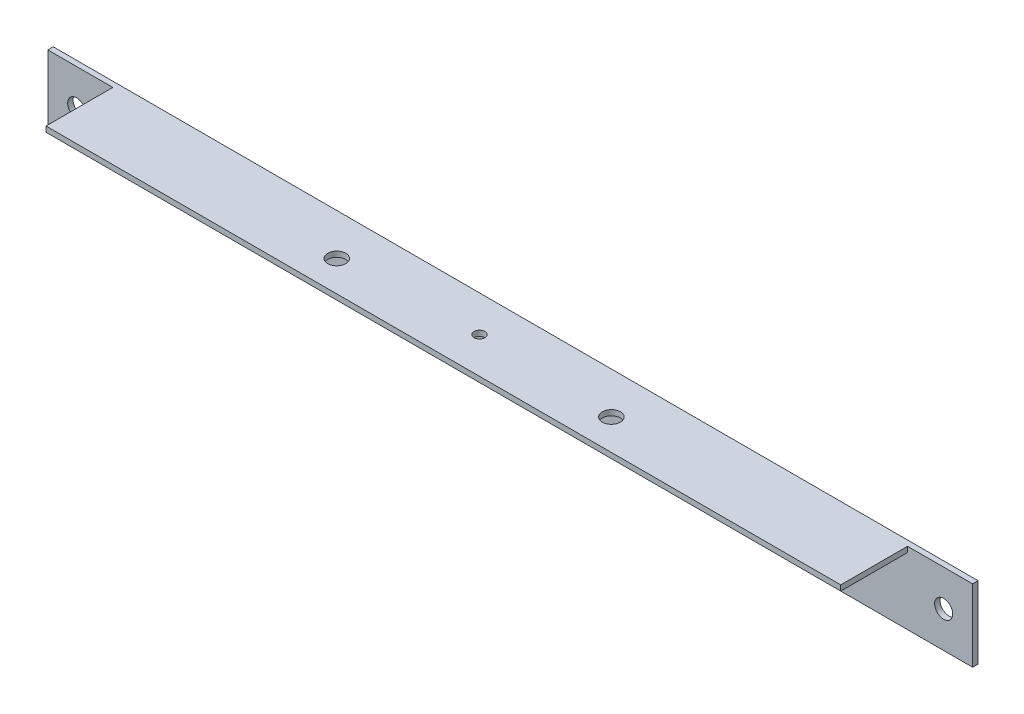
ISO-10303-21;
HEADER;
FILE_DESCRIPTION(('STEP AP214'),'2;1');
FILE_NAME('part.step','',(''),(''),'','','');
FILE_SCHEMA(('AUTOMOTIVE_DESIGN { 1 0 10303 214 1 1 1 1 }'));
ENDSEC;
DATA;
#1=APPLICATION_CONTEXT('core data for automotive mechanical design processes');
#2=APPLICATION_PROTOCOL_DEFINITION('international standard','automotive_design',2000,#1);
#3=PRODUCT_CONTEXT('',#1,'mechanical');
#4=PRODUCT('Part','Part','',(#3));
#5=PRODUCT_RELATED_PRODUCT_CATEGORY('part','',(#4));
#6=PRODUCT_DEFINITION_FORMATION('','',#4);
#7=PRODUCT_DEFINITION_CONTEXT('part definition',#1,'design');
#8=PRODUCT_DEFINITION('design','',#6,#7);
#9=PRODUCT_DEFINITION_SHAPE('','',#8);
#10=(LENGTH_UNIT() NAMED_UNIT(*) SI_UNIT(.MILLI.,.METRE.));
#11=(NAMED_UNIT(*) PLANE_ANGLE_UNIT() SI_UNIT($,.RADIAN.));
#12=(NAMED_UNIT(*) SI_UNIT($,.STERADIAN.) SOLID_ANGLE_UNIT());
#13=UNCERTAINTY_MEASURE_WITH_UNIT(LENGTH_MEASURE(1.E-05),#10,'distance_accuracy_value','');
#14=(GEOMETRIC_REPRESENTATION_CONTEXT(3) GLOBAL_UNCERTAINTY_ASSIGNED_CONTEXT((#13)) GLOBAL_UNIT_ASSIGNED_CONTEXT((#10,
#11,#12)) REPRESENTATION_CONTEXT('',''));
#15=CARTESIAN_POINT('',(0.,0.,0.));
#16=DIRECTION('',(0.,0.,1.));
#17=DIRECTION('',(1.,0.,0.));
#18=AXIS2_PLACEMENT_3D('',#15,#16,#17);
#19=CARTESIAN_POINT('',(128.,0.,1.5));
#20=DIRECTION('',(0.,0.,-1.));
#21=DIRECTION('',(0.,1.,0.));
#22=AXIS2_PLACEMENT_3D('',#19,#20,#21);
#23=PLANE('',#22);
#24=CARTESIAN_POINT('',(20.,-10.,1.5));
#25=DIRECTION('',(0.,0.,-1.));
#26=DIRECTION('',(0.,1.,0.));
#27=AXIS2_PLACEMENT_3D('',#24,#25,#26);
#28=CIRCLE('',#27,1.5);
#29=CARTESIAN_POINT('',(20.,-8.5,1.5));
#30=VERTEX_POINT('',#29);
#31=EDGE_CURVE('E227',#30,#30,#28,.T.);
#32=ORIENTED_EDGE('',*,*,#31,.T.);
#33=EDGE_LOOP('',(#32));
#34=FACE_BOUND('',#33,.T.);
#35=CARTESIAN_POINT('',(-20.,-10.,1.5));
#36=DIRECTION('',(0.,0.,-1.));
#37=DIRECTION('',(0.,1.,0.));
#38=AXIS2_PLACEMENT_3D('',#35,#36,#37);
#39=CIRCLE('',#38,1.5);
#40=CARTESIAN_POINT('',(-20.,-8.5,1.5));
#41=VERTEX_POINT('',#40);
#42=EDGE_CURVE('E230',#41,#41,#39,.T.);
#43=ORIENTED_EDGE('',*,*,#42,.T.);
#44=EDGE_LOOP('',(#43));
#45=FACE_BOUND('',#44,.T.);
#46=CARTESIAN_POINT('',(120.,-9.99999999999995,1.5));
#47=DIRECTION('',(0.,0.,1.));
#48=DIRECTION('',(-1.,0.,0.));
#49=AXIS2_PLACEMENT_3D('',#46,#47,#48);
#50=CIRCLE('',#49,2.5);
#51=CARTESIAN_POINT('',(117.5,-9.99999999999995,1.5));
#52=VERTEX_POINT('',#51);
#53=EDGE_CURVE('E146',#52,#52,#50,.T.);
#54=ORIENTED_EDGE('',*,*,#53,.F.);
#55=EDGE_LOOP('',(#54));
#56=FACE_BOUND('',#55,.T.);
#57=CARTESIAN_POINT('',(-120.,-9.99999999999995,1.5));
#58=DIRECTION('',(0.,0.,1.));
#59=DIRECTION('',(1.,0.,0.));
#60=AXIS2_PLACEMENT_3D('',#57,#58,#59);
#61=CIRCLE('',#60,2.5);
#62=CARTESIAN_POINT('',(-117.5,-9.99999999999995,1.5));
#63=VERTEX_POINT('',#62);
#64=EDGE_CURVE('E143',#63,#63,#61,.T.);
#65=ORIENTED_EDGE('',*,*,#64,.F.);
#66=EDGE_LOOP('',(#65));
#67=FACE_BOUND('',#66,.T.);
#68=DIRECTION('',(0.,-1.,0.));
#69=VECTOR('',#68,1.);
#70=CARTESIAN_POINT('',(-128.,0.,1.5));
#71=LINE('',#70,#69);
#72=CARTESIAN_POINT('',(-128.,0.,1.5));
#73=VERTEX_POINT('',#72);
#74=CARTESIAN_POINT('',(-128.,-20.,1.5));
#75=VERTEX_POINT('',#74);
#76=EDGE_CURVE('E49',#73,#75,#71,.T.);
#77=ORIENTED_EDGE('',*,*,#76,.T.);
#78=DIRECTION('',(-1.,0.,0.));
#79=VECTOR('',#78,1.);
#80=CARTESIAN_POINT('',(128.,-20.,1.5));
#81=LINE('',#80,#79);
#82=CARTESIAN_POINT('',(128.,-20.,1.5));
#83=VERTEX_POINT('',#82);
#84=EDGE_CURVE('E11',#83,#75,#81,.T.);
#85=ORIENTED_EDGE('',*,*,#84,.F.);
#86=DIRECTION('',(0.,-1.,0.));
#87=VECTOR('',#86,1.);
#88=CARTESIAN_POINT('',(128.,0.,1.5));
#89=LINE('',#88,#87);
#90=CARTESIAN_POINT('',(128.,0.,1.5));
#91=VERTEX_POINT('',#90);
#92=EDGE_CURVE('E78',#91,#83,#89,.T.);
#93=ORIENTED_EDGE('',*,*,#92,.F.);
#94=DIRECTION('',(-1.,0.,0.));
#95=VECTOR('',#94,1.);
#96=CARTESIAN_POINT('',(128.,0.,1.5));
#97=LINE('',#96,#95);
#98=CARTESIAN_POINT('',(110.,0.,1.5));
#99=VERTEX_POINT('',#98);
#100=EDGE_CURVE('E192',#91,#99,#97,.T.);
#101=ORIENTED_EDGE('',*,*,#100,.T.);
#102=DIRECTION('',(0.,-1.,0.));
#103=VECTOR('',#102,1.);
#104=CARTESIAN_POINT('',(110.,8.5,1.5));
#105=LINE('',#104,#103);
#106=CARTESIAN_POINT('',(110.,-1.5,1.5));
#107=VERTEX_POINT('',#106);
#108=EDGE_CURVE('E119',#99,#107,#105,.T.);
#109=ORIENTED_EDGE('',*,*,#108,.T.);
#110=DIRECTION('',(-1.,0.,0.));
#111=VECTOR('',#110,1.);
#112=CARTESIAN_POINT('',(128.,-1.5,1.5));
#113=LINE('',#112,#111);
#114=CARTESIAN_POINT('',(-110.,-1.5,1.5));
#115=VERTEX_POINT('',#114);
#116=EDGE_CURVE('E126',#107,#115,#113,.T.);
#117=ORIENTED_EDGE('',*,*,#116,.T.);
#118=DIRECTION('',(0.,-1.,0.));
#119=VECTOR('',#118,1.);
#120=CARTESIAN_POINT('',(-110.,8.5,1.5));
#121=LINE('',#120,#119);
#122=CARTESIAN_POINT('',(-110.,0.,1.5));
#123=VERTEX_POINT('',#122);
#124=EDGE_CURVE('E186',#123,#115,#121,.T.);
#125=ORIENTED_EDGE('',*,*,#124,.F.);
#126=DIRECTION('',(-1.,0.,0.));
#127=VECTOR('',#126,1.);
#128=CARTESIAN_POINT('',(128.,0.,1.5));
#129=LINE('',#128,#127);
#130=EDGE_CURVE('E184',#123,#73,#129,.T.);
#131=ORIENTED_EDGE('',*,*,#130,.T.);
#132=EDGE_LOOP('',(#77,#85,#93,#101,#109,#117,#125,#131));
#133=FACE_BOUND('',#132,.T.);
#134=ADVANCED_FACE('F33',(#34,#45,#56,#67,#133),#23,.F.);
#135=CARTESIAN_POINT('',(128.,-20.,0.));
#136=DIRECTION('',(0.,-1.,0.));
#137=DIRECTION('',(0.,0.,-1.));
#138=AXIS2_PLACEMENT_3D('',#135,#136,#137);
#139=PLANE('',#138);
#140=DIRECTION('',(0.,0.,1.));
#141=VECTOR('',#140,1.);
#142=CARTESIAN_POINT('',(-128.,-20.,0.));
#143=LINE('',#142,#141);
#144=CARTESIAN_POINT('',(-128.,-20.,0.));
#145=VERTEX_POINT('',#144);
#146=EDGE_CURVE('E170',#145,#75,#143,.T.);
#147=ORIENTED_EDGE('',*,*,#146,.F.);
#148=DIRECTION('',(-1.,0.,0.));
#149=VECTOR('',#148,1.);
#150=CARTESIAN_POINT('',(128.,-20.,0.));
#151=LINE('',#150,#149);
#152=CARTESIAN_POINT('',(128.,-20.,0.));
#153=VERTEX_POINT('',#152);
#154=EDGE_CURVE('E41',#153,#145,#151,.T.);
#155=ORIENTED_EDGE('',*,*,#154,.F.);
#156=DIRECTION('',(0.,0.,1.));
#157=VECTOR('',#156,1.);
#158=CARTESIAN_POINT('',(128.,-20.,0.));
#159=LINE('',#158,#157);
#160=EDGE_CURVE('E162',#153,#83,#159,.T.);
#161=ORIENTED_EDGE('',*,*,#160,.T.);
#162=ORIENTED_EDGE('',*,*,#84,.T.);
#163=EDGE_LOOP('',(#147,#155,#161,#162));
#164=FACE_BOUND('',#163,.T.);
#165=ADVANCED_FACE('F180',(#164),#139,.T.);
#166=CARTESIAN_POINT('',(128.,0.,0.));
#167=DIRECTION('',(0.,0.,-1.));
#168=DIRECTION('',(0.,1.,0.));
#169=AXIS2_PLACEMENT_3D('',#166,#167,#168);
#170=PLANE('',#169);
#171=CARTESIAN_POINT('',(20.,-10.,0.));
#172=DIRECTION('',(0.,0.,-1.));
#173=DIRECTION('',(0.,1.,0.));
#174=AXIS2_PLACEMENT_3D('',#171,#172,#173);
#175=CIRCLE('',#174,1.5);
#176=CARTESIAN_POINT('',(20.,-8.5,0.));
#177=VERTEX_POINT('',#176);
#178=EDGE_CURVE('E233',#177,#177,#175,.T.);
#179=ORIENTED_EDGE('',*,*,#178,.F.);
#180=EDGE_LOOP('',(#179));
#181=FACE_BOUND('',#180,.T.);
#182=CARTESIAN_POINT('',(-20.,-10.,0.));
#183=DIRECTION('',(0.,0.,-1.));
#184=DIRECTION('',(0.,-1.,0.));
#185=AXIS2_PLACEMENT_3D('',#182,#183,#184);
#186=CIRCLE('',#185,1.5);
#187=CARTESIAN_POINT('',(-20.,-11.5,0.));
#188=VERTEX_POINT('',#187);
#189=EDGE_CURVE('E234',#188,#188,#186,.T.);
#190=ORIENTED_EDGE('',*,*,#189,.F.);
#191=EDGE_LOOP('',(#190));
#192=FACE_BOUND('',#191,.T.);
#193=CARTESIAN_POINT('',(120.,-9.99999999999995,0.));
#194=DIRECTION('',(0.,0.,-1.));
#195=DIRECTION('',(0.,1.,0.));
#196=AXIS2_PLACEMENT_3D('',#193,#194,#195);
#197=CIRCLE('',#196,2.5);
#198=CARTESIAN_POINT('',(120.,-7.49999999999996,0.));
#199=VERTEX_POINT('',#198);
#200=EDGE_CURVE('E144',#199,#199,#197,.T.);
#201=ORIENTED_EDGE('',*,*,#200,.F.);
#202=EDGE_LOOP('',(#201));
#203=FACE_BOUND('',#202,.T.);
#204=CARTESIAN_POINT('',(-120.,-9.99999999999995,0.));
#205=DIRECTION('',(0.,0.,-1.));
#206=DIRECTION('',(0.,1.,0.));
#207=AXIS2_PLACEMENT_3D('',#204,#205,#206);
#208=CIRCLE('',#207,2.5);
#209=CARTESIAN_POINT('',(-120.,-7.49999999999996,0.));
#210=VERTEX_POINT('',#209);
#211=EDGE_CURVE('E141',#210,#210,#208,.T.);
#212=ORIENTED_EDGE('',*,*,#211,.F.);
#213=EDGE_LOOP('',(#212));
#214=FACE_BOUND('',#213,.T.);
#215=DIRECTION('',(0.,-1.,0.));
#216=VECTOR('',#215,1.);
#217=CARTESIAN_POINT('',(-128.,0.,0.));
#218=LINE('',#217,#216);
#219=CARTESIAN_POINT('',(-128.,0.,0.));
#220=VERTEX_POINT('',#219);
#221=EDGE_CURVE('E172',#220,#145,#218,.T.);
#222=ORIENTED_EDGE('',*,*,#221,.F.);
#223=DIRECTION('',(-1.,0.,0.));
#224=VECTOR('',#223,1.);
#225=CARTESIAN_POINT('',(128.,0.,0.));
#226=LINE('',#225,#224);
#227=CARTESIAN_POINT('',(128.,0.,0.));
#228=VERTEX_POINT('',#227);
#229=EDGE_CURVE('E134',#228,#220,#226,.T.);
#230=ORIENTED_EDGE('',*,*,#229,.F.);
#231=DIRECTION('',(0.,-1.,0.));
#232=VECTOR('',#231,1.);
#233=CARTESIAN_POINT('',(128.,0.,0.));
#234=LINE('',#233,#232);
#235=EDGE_CURVE('E165',#228,#153,#234,.T.);
#236=ORIENTED_EDGE('',*,*,#235,.T.);
#237=ORIENTED_EDGE('',*,*,#154,.T.);
#238=EDGE_LOOP('',(#222,#230,#236,#237));
#239=FACE_BOUND('',#238,.T.);
#240=ADVANCED_FACE('F177',(#181,#192,#203,#214,#239),#170,.T.);
#241=CARTESIAN_POINT('',(128.,0.,20.));
#242=DIRECTION('',(0.,1.,0.));
#243=DIRECTION('',(0.,0.,1.));
#244=AXIS2_PLACEMENT_3D('',#241,#242,#243);
#245=PLANE('',#244);
#246=CARTESIAN_POINT('',(0.,0.,10.));
#247=DIRECTION('',(0.,1.,0.));
#248=DIRECTION('',(0.,0.,1.));
#249=AXIS2_PLACEMENT_3D('',#246,#247,#248);
#250=CIRCLE('',#249,1.5);
#251=CARTESIAN_POINT('',(0.,0.,11.5));
#252=VERTEX_POINT('',#251);
#253=EDGE_CURVE('E224',#252,#252,#250,.T.);
#254=ORIENTED_EDGE('',*,*,#253,.F.);
#255=EDGE_LOOP('',(#254));
#256=FACE_BOUND('',#255,.T.);
#257=ORIENTED_EDGE('',*,*,#100,.F.);
#258=DIRECTION('',(0.,0.,-1.));
#259=VECTOR('',#258,1.);
#260=CARTESIAN_POINT('',(128.,0.,20.));
#261=LINE('',#260,#259);
#262=EDGE_CURVE('E58',#91,#228,#261,.T.);
#263=ORIENTED_EDGE('',*,*,#262,.T.);
#264=ORIENTED_EDGE('',*,*,#229,.T.);
#265=DIRECTION('',(0.,0.,-1.));
#266=VECTOR('',#265,1.);
#267=CARTESIAN_POINT('',(-128.,0.,20.));
#268=LINE('',#267,#266);
#269=EDGE_CURVE('E73',#73,#220,#268,.T.);
#270=ORIENTED_EDGE('',*,*,#269,.F.);
#271=ORIENTED_EDGE('',*,*,#130,.F.);
#272=DIRECTION('',(0.,0.,-1.));
#273=VECTOR('',#272,1.);
#274=CARTESIAN_POINT('',(-110.,0.,19.9999999999998));
#275=LINE('',#274,#273);
#276=CARTESIAN_POINT('',(-110.,0.,20.));
#277=VERTEX_POINT('',#276);
#278=EDGE_CURVE('E188',#277,#123,#275,.T.);
#279=ORIENTED_EDGE('',*,*,#278,.F.);
#280=DIRECTION('',(-1.,0.,0.));
#281=VECTOR('',#280,1.);
#282=CARTESIAN_POINT('',(128.,0.,20.));
#283=LINE('',#282,#281);
#284=CARTESIAN_POINT('',(110.,0.,20.));
#285=VERTEX_POINT('',#284);
#286=EDGE_CURVE('E132',#285,#277,#283,.T.);
#287=ORIENTED_EDGE('',*,*,#286,.F.);
#288=DIRECTION('',(0.,0.,1.));
#289=VECTOR('',#288,1.);
#290=CARTESIAN_POINT('',(110.,0.,20.));
#291=LINE('',#290,#289);
#292=EDGE_CURVE('E115',#99,#285,#291,.T.);
#293=ORIENTED_EDGE('',*,*,#292,.F.);
#294=EDGE_LOOP('',(#257,#263,#264,#270,#271,#279,#287,#293));
#295=FACE_BOUND('',#294,.T.);
#296=CARTESIAN_POINT('',(38.,0.,11.5));
#297=DIRECTION('',(0.,1.,0.));
#298=DIRECTION('',(0.,0.,1.));
#299=AXIS2_PLACEMENT_3D('',#296,#297,#298);
#300=CIRCLE('',#299,2.5);
#301=CARTESIAN_POINT('',(38.,0.,14.));
#302=VERTEX_POINT('',#301);
#303=EDGE_CURVE('E199',#302,#302,#300,.T.);
#304=ORIENTED_EDGE('',*,*,#303,.F.);
#305=EDGE_LOOP('',(#304));
#306=FACE_BOUND('',#305,.T.);
#307=CARTESIAN_POINT('',(-38.,0.,11.5));
#308=DIRECTION('',(0.,1.,0.));
#309=DIRECTION('',(0.,0.,1.));
#310=AXIS2_PLACEMENT_3D('',#307,#308,#309);
#311=CIRCLE('',#310,2.5);
#312=CARTESIAN_POINT('',(-38.,0.,14.));
#313=VERTEX_POINT('',#312);
#314=EDGE_CURVE('E152',#313,#313,#311,.T.);
#315=ORIENTED_EDGE('',*,*,#314,.F.);
#316=EDGE_LOOP('',(#315));
#317=FACE_BOUND('',#316,.T.);
#318=ADVANCED_FACE('F190',(#256,#295,#306,#317),#245,.T.);
#319=CARTESIAN_POINT('',(128.,-1.5,20.));
#320=DIRECTION('',(0.,0.,1.));
#321=DIRECTION('',(1.,0.,0.));
#322=AXIS2_PLACEMENT_3D('',#319,#320,#321);
#323=PLANE('',#322);
#324=DIRECTION('',(0.,-1.,0.));
#325=VECTOR('',#324,1.);
#326=CARTESIAN_POINT('',(110.,8.5,20.));
#327=LINE('',#326,#325);
#328=CARTESIAN_POINT('',(110.,-1.5,20.));
#329=VERTEX_POINT('',#328);
#330=EDGE_CURVE('E108',#285,#329,#327,.T.);
#331=ORIENTED_EDGE('',*,*,#330,.F.);
#332=ORIENTED_EDGE('',*,*,#286,.T.);
#333=DIRECTION('',(0.,-1.,0.));
#334=VECTOR('',#333,1.);
#335=CARTESIAN_POINT('',(-110.,8.5,20.));
#336=LINE('',#335,#334);
#337=CARTESIAN_POINT('',(-110.,-1.5,20.));
#338=VERTEX_POINT('',#337);
#339=EDGE_CURVE('E131',#277,#338,#336,.T.);
#340=ORIENTED_EDGE('',*,*,#339,.T.);
#341=DIRECTION('',(-1.,0.,0.));
#342=VECTOR('',#341,1.);
#343=CARTESIAN_POINT('',(128.,-1.5,20.));
#344=LINE('',#343,#342);
#345=EDGE_CURVE('E124',#329,#338,#344,.T.);
#346=ORIENTED_EDGE('',*,*,#345,.F.);
#347=EDGE_LOOP('',(#331,#332,#340,#346));
#348=FACE_BOUND('',#347,.T.);
#349=ADVANCED_FACE('F129',(#348),#323,.T.);
#350=CARTESIAN_POINT('',(128.,-1.5,20.));
#351=DIRECTION('',(0.,1.,0.));
#352=DIRECTION('',(0.,0.,1.));
#353=AXIS2_PLACEMENT_3D('',#350,#351,#352);
#354=PLANE('',#353);
#355=CARTESIAN_POINT('',(0.,-1.5,10.));
#356=DIRECTION('',(0.,1.,0.));
#357=DIRECTION('',(0.,0.,1.));
#358=AXIS2_PLACEMENT_3D('',#355,#356,#357);
#359=CIRCLE('',#358,1.5);
#360=CARTESIAN_POINT('',(0.,-1.5,11.5));
#361=VERTEX_POINT('',#360);
#362=EDGE_CURVE('E36',#361,#361,#359,.T.);
#363=ORIENTED_EDGE('',*,*,#362,.T.);
#364=EDGE_LOOP('',(#363));
#365=FACE_BOUND('',#364,.T.);
#366=CARTESIAN_POINT('',(38.,-1.5,11.5));
#367=DIRECTION('',(0.,-1.,0.));
#368=DIRECTION('',(0.,0.,1.));
#369=AXIS2_PLACEMENT_3D('',#366,#367,#368);
#370=CIRCLE('',#369,2.5);
#371=CARTESIAN_POINT('',(38.,-1.5,14.));
#372=VERTEX_POINT('',#371);
#373=EDGE_CURVE('E218',#372,#372,#370,.T.);
#374=ORIENTED_EDGE('',*,*,#373,.F.);
#375=EDGE_LOOP('',(#374));
#376=FACE_BOUND('',#375,.T.);
#377=CARTESIAN_POINT('',(-38.,-1.5,11.5));
#378=DIRECTION('',(0.,-1.,0.));
#379=DIRECTION('',(0.,0.,-1.));
#380=AXIS2_PLACEMENT_3D('',#377,#378,#379);
#381=CIRCLE('',#380,2.5);
#382=CARTESIAN_POINT('',(-38.,-1.5,9.));
#383=VERTEX_POINT('',#382);
#384=EDGE_CURVE('E157',#383,#383,#381,.T.);
#385=ORIENTED_EDGE('',*,*,#384,.F.);
#386=EDGE_LOOP('',(#385));
#387=FACE_BOUND('',#386,.T.);
#388=ORIENTED_EDGE('',*,*,#116,.F.);
#389=DIRECTION('',(0.,0.,-1.));
#390=VECTOR('',#389,1.);
#391=CARTESIAN_POINT('',(110.,-1.5,20.));
#392=LINE('',#391,#390);
#393=EDGE_CURVE('E112',#329,#107,#392,.T.);
#394=ORIENTED_EDGE('',*,*,#393,.F.);
#395=ORIENTED_EDGE('',*,*,#345,.T.);
#396=DIRECTION('',(0.,0.,1.));
#397=VECTOR('',#396,1.);
#398=CARTESIAN_POINT('',(-110.,-1.5,20.));
#399=LINE('',#398,#397);
#400=EDGE_CURVE('E214',#115,#338,#399,.T.);
#401=ORIENTED_EDGE('',*,*,#400,.F.);
#402=EDGE_LOOP('',(#388,#394,#395,#401));
#403=FACE_BOUND('',#402,.T.);
#404=ADVANCED_FACE('F122',(#365,#376,#387,#403),#354,.F.);
#405=CARTESIAN_POINT('',(128.,0.,0.));
#406=DIRECTION('',(-1.,0.,0.));
#407=DIRECTION('',(0.,0.,1.));
#408=AXIS2_PLACEMENT_3D('',#405,#406,#407);
#409=PLANE('',#408);
#410=ORIENTED_EDGE('',*,*,#262,.F.);
#411=ORIENTED_EDGE('',*,*,#92,.T.);
#412=ORIENTED_EDGE('',*,*,#160,.F.);
#413=ORIENTED_EDGE('',*,*,#235,.F.);
#414=EDGE_LOOP('',(#410,#411,#412,#413));
#415=FACE_BOUND('',#414,.T.);
#416=ADVANCED_FACE('F292',(#415),#409,.F.);
#417=CARTESIAN_POINT('',(-128.,0.,0.));
#418=DIRECTION('',(-1.,0.,0.));
#419=DIRECTION('',(0.,0.,1.));
#420=AXIS2_PLACEMENT_3D('',#417,#418,#419);
#421=PLANE('',#420);
#422=ORIENTED_EDGE('',*,*,#76,.F.);
#423=ORIENTED_EDGE('',*,*,#269,.T.);
#424=ORIENTED_EDGE('',*,*,#221,.T.);
#425=ORIENTED_EDGE('',*,*,#146,.T.);
#426=EDGE_LOOP('',(#422,#423,#424,#425));
#427=FACE_BOUND('',#426,.T.);
#428=ADVANCED_FACE('F174',(#427),#421,.T.);
#429=CARTESIAN_POINT('',(-120.,-9.99999999999995,-8.5));
#430=DIRECTION('',(0.,0.,1.));
#431=DIRECTION('',(1.,0.,0.));
#432=AXIS2_PLACEMENT_3D('',#429,#430,#431);
#433=CYLINDRICAL_SURFACE('',#432,2.5);
#434=ORIENTED_EDGE('',*,*,#211,.T.);
#435=EDGE_LOOP('',(#434));
#436=FACE_BOUND('',#435,.T.);
#437=ORIENTED_EDGE('',*,*,#64,.T.);
#438=EDGE_LOOP('',(#437));
#439=FACE_BOUND('',#438,.T.);
#440=ADVANCED_FACE('F251',(#436,#439),#433,.F.);
#441=CARTESIAN_POINT('',(120.,-9.99999999999995,-8.5));
#442=DIRECTION('',(0.,0.,1.));
#443=DIRECTION('',(1.,0.,0.));
#444=AXIS2_PLACEMENT_3D('',#441,#442,#443);
#445=CYLINDRICAL_SURFACE('',#444,2.5);
#446=ORIENTED_EDGE('',*,*,#200,.T.);
#447=EDGE_LOOP('',(#446));
#448=FACE_BOUND('',#447,.T.);
#449=ORIENTED_EDGE('',*,*,#53,.T.);
#450=EDGE_LOOP('',(#449));
#451=FACE_BOUND('',#450,.T.);
#452=ADVANCED_FACE('F206',(#448,#451),#445,.F.);
#453=CARTESIAN_POINT('',(-38.,8.5,11.5));
#454=DIRECTION('',(0.,-1.,0.));
#455=DIRECTION('',(0.,0.,-1.));
#456=AXIS2_PLACEMENT_3D('',#453,#454,#455);
#457=CYLINDRICAL_SURFACE('',#456,2.5);
#458=ORIENTED_EDGE('',*,*,#314,.T.);
#459=EDGE_LOOP('',(#458));
#460=FACE_BOUND('',#459,.T.);
#461=ORIENTED_EDGE('',*,*,#384,.T.);
#462=EDGE_LOOP('',(#461));
#463=FACE_BOUND('',#462,.T.);
#464=ADVANCED_FACE('F202',(#460,#463),#457,.F.);
#465=CARTESIAN_POINT('',(-110.,8.5,20.));
#466=DIRECTION('',(1.,0.,0.));
#467=DIRECTION('',(0.,0.,-1.));
#468=AXIS2_PLACEMENT_3D('',#465,#466,#467);
#469=PLANE('',#468);
#470=ORIENTED_EDGE('',*,*,#278,.T.);
#471=ORIENTED_EDGE('',*,*,#124,.T.);
#472=ORIENTED_EDGE('',*,*,#400,.T.);
#473=ORIENTED_EDGE('',*,*,#339,.F.);
#474=EDGE_LOOP('',(#470,#471,#472,#473));
#475=FACE_BOUND('',#474,.T.);
#476=ADVANCED_FACE('F205',(#475),#469,.F.);
#477=CARTESIAN_POINT('',(38.,8.5,11.5));
#478=DIRECTION('',(0.,-1.,0.));
#479=DIRECTION('',(0.,0.,-1.));
#480=AXIS2_PLACEMENT_3D('',#477,#478,#479);
#481=CYLINDRICAL_SURFACE('',#480,2.5);
#482=ORIENTED_EDGE('',*,*,#303,.T.);
#483=EDGE_LOOP('',(#482));
#484=FACE_BOUND('',#483,.T.);
#485=ORIENTED_EDGE('',*,*,#373,.T.);
#486=EDGE_LOOP('',(#485));
#487=FACE_BOUND('',#486,.T.);
#488=ADVANCED_FACE('F283',(#484,#487),#481,.F.);
#489=CARTESIAN_POINT('',(110.,8.5,20.));
#490=DIRECTION('',(-1.,0.,0.));
#491=DIRECTION('',(0.,0.,1.));
#492=AXIS2_PLACEMENT_3D('',#489,#490,#491);
#493=PLANE('',#492);
#494=ORIENTED_EDGE('',*,*,#292,.T.);
#495=ORIENTED_EDGE('',*,*,#330,.T.);
#496=ORIENTED_EDGE('',*,*,#393,.T.);
#497=ORIENTED_EDGE('',*,*,#108,.F.);
#498=EDGE_LOOP('',(#494,#495,#496,#497));
#499=FACE_BOUND('',#498,.T.);
#500=ADVANCED_FACE('F110',(#499),#493,.F.);
#501=CARTESIAN_POINT('',(0.,-5.,10.));
#502=DIRECTION('',(0.,1.,0.));
#503=DIRECTION('',(0.,0.,1.));
#504=AXIS2_PLACEMENT_3D('',#501,#502,#503);
#505=CYLINDRICAL_SURFACE('',#504,1.5);
#506=ORIENTED_EDGE('',*,*,#253,.T.);
#507=EDGE_LOOP('',(#506));
#508=FACE_BOUND('',#507,.T.);
#509=ORIENTED_EDGE('',*,*,#362,.F.);
#510=EDGE_LOOP('',(#509));
#511=FACE_BOUND('',#510,.T.);
#512=ADVANCED_FACE('F270',(#508,#511),#505,.F.);
#513=CARTESIAN_POINT('',(-20.,-10.,5.));
#514=DIRECTION('',(0.,0.,-1.));
#515=DIRECTION('',(0.,1.,0.));
#516=AXIS2_PLACEMENT_3D('',#513,#514,#515);
#517=CYLINDRICAL_SURFACE('',#516,1.5);
#518=ORIENTED_EDGE('',*,*,#189,.T.);
#519=EDGE_LOOP('',(#518));
#520=FACE_BOUND('',#519,.T.);
#521=ORIENTED_EDGE('',*,*,#42,.F.);
#522=EDGE_LOOP('',(#521));
#523=FACE_BOUND('',#522,.T.);
#524=ADVANCED_FACE('F268',(#520,#523),#517,.F.);
#525=CARTESIAN_POINT('',(20.,-10.,5.));
#526=DIRECTION('',(0.,0.,-1.));
#527=DIRECTION('',(0.,1.,0.));
#528=AXIS2_PLACEMENT_3D('',#525,#526,#527);
#529=CYLINDRICAL_SURFACE('',#528,1.5);
#530=ORIENTED_EDGE('',*,*,#178,.T.);
#531=EDGE_LOOP('',(#530));
#532=FACE_BOUND('',#531,.T.);
#533=ORIENTED_EDGE('',*,*,#31,.F.);
#534=EDGE_LOOP('',(#533));
#535=FACE_BOUND('',#534,.T.);
#536=ADVANCED_FACE('F240',(#532,#535),#529,.F.);
#537=CLOSED_SHELL('',(#134,#165,#240,#318,#349,#404,#416,#428,#440,#452,#464,#476,#488,#500,
#512,#524,#536));
#538=MANIFOLD_SOLID_BREP('B2',#537);
#539=ADVANCED_BREP_SHAPE_REPRESENTATION('',(#18,#538),#14);
#540=SHAPE_DEFINITION_REPRESENTATION(#9,#539);
ENDSEC;
END-ISO-10303-21;
